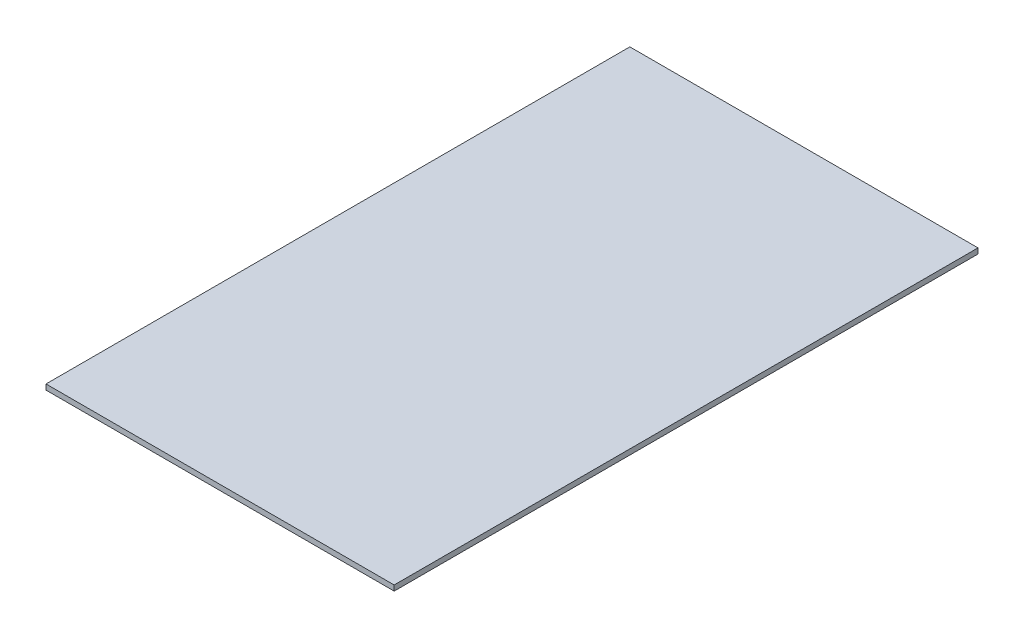
ISO-10303-21;
HEADER;
FILE_DESCRIPTION(('STEP AP214'),'2;1');
FILE_NAME('part.step','',(''),(''),'','','');
FILE_SCHEMA(('AUTOMOTIVE_DESIGN { 1 0 10303 214 1 1 1 1 }'));
ENDSEC;
DATA;
#1=APPLICATION_CONTEXT('core data for automotive mechanical design processes');
#2=APPLICATION_PROTOCOL_DEFINITION('international standard','automotive_design',2000,#1);
#3=PRODUCT_CONTEXT('',#1,'mechanical');
#4=PRODUCT('Part','Part','',(#3));
#5=PRODUCT_RELATED_PRODUCT_CATEGORY('part','',(#4));
#6=PRODUCT_DEFINITION_FORMATION('','',#4);
#7=PRODUCT_DEFINITION_CONTEXT('part definition',#1,'design');
#8=PRODUCT_DEFINITION('design','',#6,#7);
#9=PRODUCT_DEFINITION_SHAPE('','',#8);
#10=(LENGTH_UNIT() NAMED_UNIT(*) SI_UNIT(.MILLI.,.METRE.));
#11=(NAMED_UNIT(*) PLANE_ANGLE_UNIT() SI_UNIT($,.RADIAN.));
#12=(NAMED_UNIT(*) SI_UNIT($,.STERADIAN.) SOLID_ANGLE_UNIT());
#13=UNCERTAINTY_MEASURE_WITH_UNIT(LENGTH_MEASURE(1.E-05),#10,'distance_accuracy_value','');
#14=(GEOMETRIC_REPRESENTATION_CONTEXT(3) GLOBAL_UNCERTAINTY_ASSIGNED_CONTEXT((#13)) GLOBAL_UNIT_ASSIGNED_CONTEXT((#10,
#11,#12)) REPRESENTATION_CONTEXT('',''));
#15=CARTESIAN_POINT('',(0.,0.,0.));
#16=DIRECTION('',(0.,0.,1.));
#17=DIRECTION('',(1.,0.,0.));
#18=AXIS2_PLACEMENT_3D('',#15,#16,#17);
#19=CARTESIAN_POINT('',(65.,1.,-109.));
#20=DIRECTION('',(-1.,0.,0.));
#21=DIRECTION('',(0.,0.,1.));
#22=AXIS2_PLACEMENT_3D('',#19,#20,#21);
#23=PLANE('',#22);
#24=DIRECTION('',(0.,0.,-1.));
#25=VECTOR('',#24,1.);
#26=CARTESIAN_POINT('',(65.,-1.,-109.));
#27=LINE('',#26,#25);
#28=CARTESIAN_POINT('',(65.,-1.,109.));
#29=VERTEX_POINT('',#28);
#30=CARTESIAN_POINT('',(65.,-1.,-109.));
#31=VERTEX_POINT('',#30);
#32=EDGE_CURVE('E107',#29,#31,#27,.T.);
#33=ORIENTED_EDGE('',*,*,#32,.T.);
#34=DIRECTION('',(0.,-1.,0.));
#35=VECTOR('',#34,1.);
#36=CARTESIAN_POINT('',(65.,1.,-109.));
#37=LINE('',#36,#35);
#38=CARTESIAN_POINT('',(65.,1.,-109.));
#39=VERTEX_POINT('',#38);
#40=EDGE_CURVE('E11',#39,#31,#37,.T.);
#41=ORIENTED_EDGE('',*,*,#40,.F.);
#42=DIRECTION('',(0.,0.,-1.));
#43=VECTOR('',#42,1.);
#44=CARTESIAN_POINT('',(65.,1.,-109.));
#45=LINE('',#44,#43);
#46=CARTESIAN_POINT('',(65.,1.,109.));
#47=VERTEX_POINT('',#46);
#48=EDGE_CURVE('E91',#47,#39,#45,.T.);
#49=ORIENTED_EDGE('',*,*,#48,.F.);
#50=DIRECTION('',(0.,-1.,0.));
#51=VECTOR('',#50,1.);
#52=CARTESIAN_POINT('',(65.,1.,109.));
#53=LINE('',#52,#51);
#54=EDGE_CURVE('E103',#47,#29,#53,.T.);
#55=ORIENTED_EDGE('',*,*,#54,.T.);
#56=EDGE_LOOP('',(#33,#41,#49,#55));
#57=FACE_BOUND('',#56,.T.);
#58=ADVANCED_FACE('F39',(#57),#23,.F.);
#59=CARTESIAN_POINT('',(-65.,1.,-109.));
#60=DIRECTION('',(0.,0.,1.));
#61=DIRECTION('',(1.,0.,0.));
#62=AXIS2_PLACEMENT_3D('',#59,#60,#61);
#63=PLANE('',#62);
#64=DIRECTION('',(-1.,0.,0.));
#65=VECTOR('',#64,1.);
#66=CARTESIAN_POINT('',(-65.,-1.,-109.));
#67=LINE('',#66,#65);
#68=CARTESIAN_POINT('',(-65.,-1.,-109.));
#69=VERTEX_POINT('',#68);
#70=EDGE_CURVE('E96',#31,#69,#67,.T.);
#71=ORIENTED_EDGE('',*,*,#70,.T.);
#72=DIRECTION('',(0.,-1.,0.));
#73=VECTOR('',#72,1.);
#74=CARTESIAN_POINT('',(-65.,1.,-109.));
#75=LINE('',#74,#73);
#76=CARTESIAN_POINT('',(-65.,1.,-109.));
#77=VERTEX_POINT('',#76);
#78=EDGE_CURVE('E48',#77,#69,#75,.T.);
#79=ORIENTED_EDGE('',*,*,#78,.F.);
#80=DIRECTION('',(-1.,0.,0.));
#81=VECTOR('',#80,1.);
#82=CARTESIAN_POINT('',(-65.,1.,-109.));
#83=LINE('',#82,#81);
#84=EDGE_CURVE('E86',#39,#77,#83,.T.);
#85=ORIENTED_EDGE('',*,*,#84,.F.);
#86=ORIENTED_EDGE('',*,*,#40,.T.);
#87=EDGE_LOOP('',(#71,#79,#85,#86));
#88=FACE_BOUND('',#87,.T.);
#89=ADVANCED_FACE('F95',(#88),#63,.F.);
#90=CARTESIAN_POINT('',(-65.,1.,-109.));
#91=DIRECTION('',(1.,0.,0.));
#92=DIRECTION('',(0.,0.,-1.));
#93=AXIS2_PLACEMENT_3D('',#90,#91,#92);
#94=PLANE('',#93);
#95=DIRECTION('',(0.,0.,1.));
#96=VECTOR('',#95,1.);
#97=CARTESIAN_POINT('',(-65.,-1.,-109.));
#98=LINE('',#97,#96);
#99=CARTESIAN_POINT('',(-65.,-1.,109.));
#100=VERTEX_POINT('',#99);
#101=EDGE_CURVE('E73',#69,#100,#98,.T.);
#102=ORIENTED_EDGE('',*,*,#101,.T.);
#103=DIRECTION('',(0.,-1.,0.));
#104=VECTOR('',#103,1.);
#105=CARTESIAN_POINT('',(-65.,1.,109.));
#106=LINE('',#105,#104);
#107=CARTESIAN_POINT('',(-65.,1.,109.));
#108=VERTEX_POINT('',#107);
#109=EDGE_CURVE('E98',#108,#100,#106,.T.);
#110=ORIENTED_EDGE('',*,*,#109,.F.);
#111=DIRECTION('',(0.,0.,1.));
#112=VECTOR('',#111,1.);
#113=CARTESIAN_POINT('',(-65.,1.,-109.));
#114=LINE('',#113,#112);
#115=EDGE_CURVE('E89',#77,#108,#114,.T.);
#116=ORIENTED_EDGE('',*,*,#115,.F.);
#117=ORIENTED_EDGE('',*,*,#78,.T.);
#118=EDGE_LOOP('',(#102,#110,#116,#117));
#119=FACE_BOUND('',#118,.T.);
#120=ADVANCED_FACE('F99',(#119),#94,.F.);
#121=CARTESIAN_POINT('',(-65.,1.,109.));
#122=DIRECTION('',(0.,0.,-1.));
#123=DIRECTION('',(-1.,0.,0.));
#124=AXIS2_PLACEMENT_3D('',#121,#122,#123);
#125=PLANE('',#124);
#126=DIRECTION('',(1.,0.,0.));
#127=VECTOR('',#126,1.);
#128=CARTESIAN_POINT('',(-65.,-1.,109.));
#129=LINE('',#128,#127);
#130=EDGE_CURVE('E79',#100,#29,#129,.T.);
#131=ORIENTED_EDGE('',*,*,#130,.T.);
#132=ORIENTED_EDGE('',*,*,#54,.F.);
#133=DIRECTION('',(1.,0.,0.));
#134=VECTOR('',#133,1.);
#135=CARTESIAN_POINT('',(-65.,1.,109.));
#136=LINE('',#135,#134);
#137=EDGE_CURVE('E56',#108,#47,#136,.T.);
#138=ORIENTED_EDGE('',*,*,#137,.F.);
#139=ORIENTED_EDGE('',*,*,#109,.T.);
#140=EDGE_LOOP('',(#131,#132,#138,#139));
#141=FACE_BOUND('',#140,.T.);
#142=ADVANCED_FACE('F120',(#141),#125,.F.);
#143=CARTESIAN_POINT('',(0.,1.,0.));
#144=DIRECTION('',(0.,1.,0.));
#145=DIRECTION('',(0.,0.,1.));
#146=AXIS2_PLACEMENT_3D('',#143,#144,#145);
#147=PLANE('',#146);
#148=ORIENTED_EDGE('',*,*,#48,.T.);
#149=ORIENTED_EDGE('',*,*,#84,.T.);
#150=ORIENTED_EDGE('',*,*,#115,.T.);
#151=ORIENTED_EDGE('',*,*,#137,.T.);
#152=EDGE_LOOP('',(#148,#149,#150,#151));
#153=FACE_BOUND('',#152,.T.);
#154=ADVANCED_FACE('F87',(#153),#147,.T.);
#155=CARTESIAN_POINT('',(0.,-1.,0.));
#156=DIRECTION('',(0.,1.,0.));
#157=DIRECTION('',(0.,0.,1.));
#158=AXIS2_PLACEMENT_3D('',#155,#156,#157);
#159=PLANE('',#158);
#160=ORIENTED_EDGE('',*,*,#32,.F.);
#161=ORIENTED_EDGE('',*,*,#130,.F.);
#162=ORIENTED_EDGE('',*,*,#101,.F.);
#163=ORIENTED_EDGE('',*,*,#70,.F.);
#164=EDGE_LOOP('',(#160,#161,#162,#163));
#165=FACE_BOUND('',#164,.T.);
#166=ADVANCED_FACE('F123',(#165),#159,.F.);
#167=CLOSED_SHELL('',(#58,#89,#120,#142,#154,#166));
#168=MANIFOLD_SOLID_BREP('B2',#167);
#169=ADVANCED_BREP_SHAPE_REPRESENTATION('',(#18,#168),#14);
#170=SHAPE_DEFINITION_REPRESENTATION(#9,#169);
ENDSEC;
END-ISO-10303-21;
